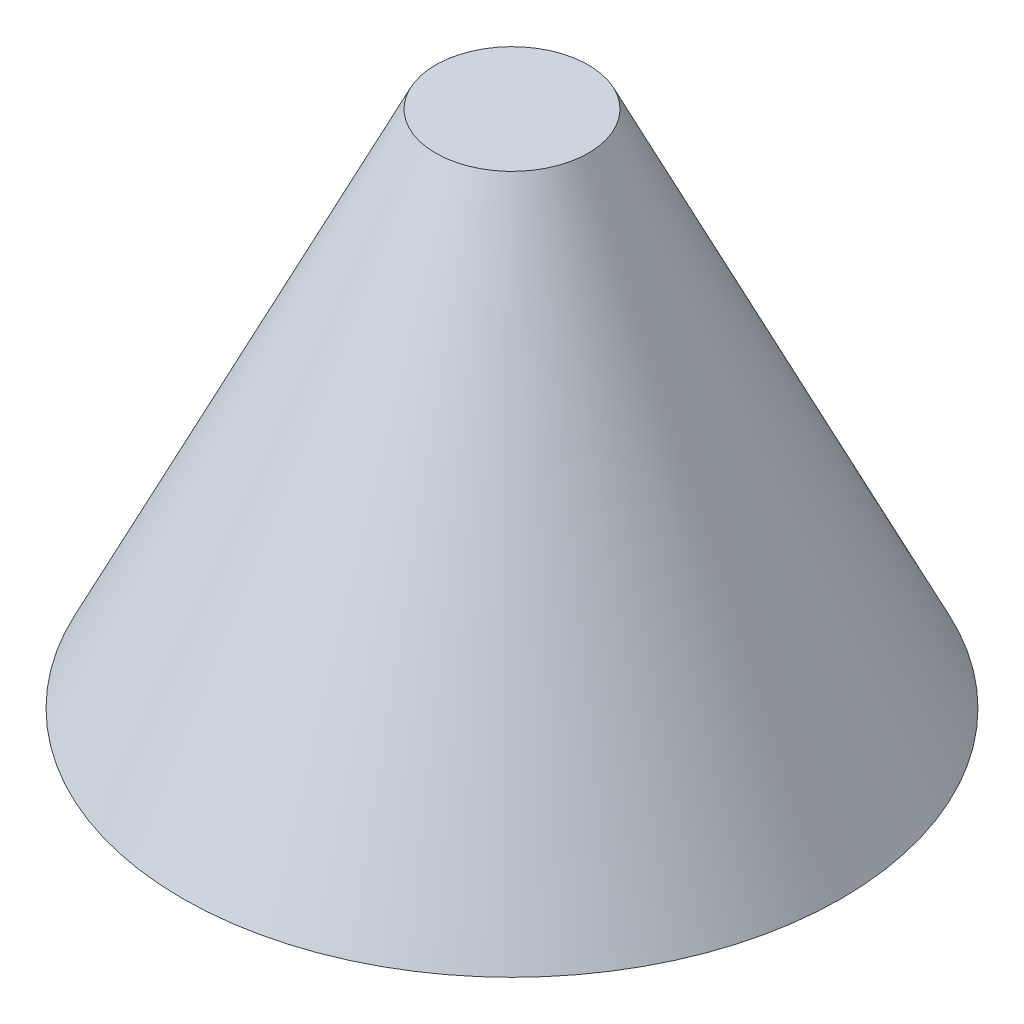
ISO-10303-21;
HEADER;
FILE_DESCRIPTION(('STEP AP214'),'2;1');
FILE_NAME('part.step','',(''),(''),'','','');
FILE_SCHEMA(('AUTOMOTIVE_DESIGN { 1 0 10303 214 1 1 1 1 }'));
ENDSEC;
DATA;
#1=APPLICATION_CONTEXT('core data for automotive mechanical design processes');
#2=APPLICATION_PROTOCOL_DEFINITION('international standard','automotive_design',2000,#1);
#3=PRODUCT_CONTEXT('',#1,'mechanical');
#4=PRODUCT('Part','Part','',(#3));
#5=PRODUCT_RELATED_PRODUCT_CATEGORY('part','',(#4));
#6=PRODUCT_DEFINITION_FORMATION('','',#4);
#7=PRODUCT_DEFINITION_CONTEXT('part definition',#1,'design');
#8=PRODUCT_DEFINITION('design','',#6,#7);
#9=PRODUCT_DEFINITION_SHAPE('','',#8);
#10=(LENGTH_UNIT() NAMED_UNIT(*) SI_UNIT(.MILLI.,.METRE.));
#11=(NAMED_UNIT(*) PLANE_ANGLE_UNIT() SI_UNIT($,.RADIAN.));
#12=(NAMED_UNIT(*) SI_UNIT($,.STERADIAN.) SOLID_ANGLE_UNIT());
#13=UNCERTAINTY_MEASURE_WITH_UNIT(LENGTH_MEASURE(1.E-05),#10,'distance_accuracy_value','');
#14=(GEOMETRIC_REPRESENTATION_CONTEXT(3) GLOBAL_UNCERTAINTY_ASSIGNED_CONTEXT((#13)) GLOBAL_UNIT_ASSIGNED_CONTEXT((#10,
#11,#12)) REPRESENTATION_CONTEXT('',''));
#15=CARTESIAN_POINT('',(0.,0.,0.));
#16=DIRECTION('',(0.,0.,1.));
#17=DIRECTION('',(1.,0.,0.));
#18=AXIS2_PLACEMENT_3D('',#15,#16,#17);
#19=CARTESIAN_POINT('',(0.,0.,0.));
#20=DIRECTION('',(0.,-1.,0.));
#21=DIRECTION('',(0.,0.,1.));
#22=AXIS2_PLACEMENT_3D('',#19,#20,#21);
#23=CONICAL_SURFACE('',#22,50.8,0.453785605518526);
#24=CARTESIAN_POINT('',(0.,80.0099999999999,0.));
#25=DIRECTION('',(0.,1.,0.));
#26=DIRECTION('',(0.,0.,1.));
#27=AXIS2_PLACEMENT_3D('',#24,#25,#26);
#28=CIRCLE('',#27,11.7765155888454);
#29=CARTESIAN_POINT('',(0.,80.0099999999999,11.7765155888454));
#30=VERTEX_POINT('',#29);
#31=EDGE_CURVE('E10',#30,#30,#28,.T.);
#32=CARTESIAN_POINT('',(0.,0.,0.));
#33=DIRECTION('',(0.,1.,0.));
#34=DIRECTION('',(0.,0.,1.));
#35=AXIS2_PLACEMENT_3D('',#32,#33,#34);
#36=CIRCLE('',#35,50.8);
#37=CARTESIAN_POINT('',(0.,0.,50.8));
#38=VERTEX_POINT('',#37);
#39=EDGE_CURVE('E38',#38,#38,#36,.T.);
#40=CARTESIAN_POINT('',(0.,80.0099999999999,11.7765155888454));
#41=CARTESIAN_POINT('',(0.,79.1765624999999,12.1830102181283));
#42=CARTESIAN_POINT('',(0.,78.3431249999999,12.5895048474111));
#43=CARTESIAN_POINT('',(0.,76.6762499999999,13.4024941059769));
#44=CARTESIAN_POINT('',(0.,75.8428124999999,13.8089887352597));
#45=CARTESIAN_POINT('',(0.,74.1759374999999,14.6219779938254));
#46=CARTESIAN_POINT('',(0.,73.3424999999999,15.0284726231083));
#47=CARTESIAN_POINT('',(0.,71.675625,15.841461881674));
#48=CARTESIAN_POINT('',(0.,70.8421875,16.2479565109569));
#49=CARTESIAN_POINT('',(0.,69.1753124999999,17.0609457695226));
#50=CARTESIAN_POINT('',(0.,68.341875,17.4674403988055));
#51=CARTESIAN_POINT('',(0.,66.675,18.2804296573712));
#52=CARTESIAN_POINT('',(0.,65.8415625,18.686924286654));
#53=CARTESIAN_POINT('',(0.,64.1746874999999,19.4999135452198));
#54=CARTESIAN_POINT('',(0.,63.34125,19.9064081745026));
#55=CARTESIAN_POINT('',(0.,61.674375,20.7193974330683));
#56=CARTESIAN_POINT('',(0.,60.8409375,21.1258920623512));
#57=CARTESIAN_POINT('',(0.,59.1740625,21.9388813209169));
#58=CARTESIAN_POINT('',(0.,58.340625,22.3453759501998));
#59=CARTESIAN_POINT('',(0.,56.67375,23.1583652087655));
#60=CARTESIAN_POINT('',(0.,55.8403125,23.5648598380484));
#61=CARTESIAN_POINT('',(0.,54.1734375,24.3778490966141));
#62=CARTESIAN_POINT('',(0.,53.34,24.7843437258969));
#63=CARTESIAN_POINT('',(0.,51.673125,25.5973329844627));
#64=CARTESIAN_POINT('',(0.,50.8396875,26.0038276137455));
#65=CARTESIAN_POINT('',(0.,49.1728125,26.8168168723112));
#66=CARTESIAN_POINT('',(0.,48.339375,27.2233115015941));
#67=CARTESIAN_POINT('',(0.,46.6725,28.0363007601598));
#68=CARTESIAN_POINT('',(0.,45.8390625,28.4427953894427));
#69=CARTESIAN_POINT('',(0.,44.1721875,29.2557846480084));
#70=CARTESIAN_POINT('',(0.,43.33875,29.6622792772913));
#71=CARTESIAN_POINT('',(0.,41.671875,30.475268535857));
#72=CARTESIAN_POINT('',(0.,40.8384375,30.8817631651398));
#73=CARTESIAN_POINT('',(0.,39.1715625,31.6947524237056));
#74=CARTESIAN_POINT('',(0.,38.338125,32.1012470529884));
#75=CARTESIAN_POINT('',(0.,36.67125,32.9142363115541));
#76=CARTESIAN_POINT('',(0.,35.8378125,33.320730940837));
#77=CARTESIAN_POINT('',(0.,34.1709375,34.1337201994027));
#78=CARTESIAN_POINT('',(0.,33.3375,34.5402148286856));
#79=CARTESIAN_POINT('',(0.,31.670625,35.3532040872513));
#80=CARTESIAN_POINT('',(0.,30.8371875,35.7596987165342));
#81=CARTESIAN_POINT('',(0.,29.1703125,36.5726879750999));
#82=CARTESIAN_POINT('',(0.,28.336875,36.9791826043827));
#83=CARTESIAN_POINT('',(0.,26.67,37.7921718629485));
#84=CARTESIAN_POINT('',(0.,25.8365625,38.1986664922313));
#85=CARTESIAN_POINT('',(0.,24.1696875,39.0116557507971));
#86=CARTESIAN_POINT('',(0.,23.33625,39.4181503800799));
#87=CARTESIAN_POINT('',(0.,21.669375,40.2311396386456));
#88=CARTESIAN_POINT('',(0.,20.8359375,40.6376342679285));
#89=CARTESIAN_POINT('',(0.,19.1690625,41.4506235264942));
#90=CARTESIAN_POINT('',(0.,18.335625,41.8571181557771));
#91=CARTESIAN_POINT('',(0.,16.66875,42.6701074143428));
#92=CARTESIAN_POINT('',(0.,15.8353125,43.0766020436257));
#93=CARTESIAN_POINT('',(0.,14.1684375,43.8895913021914));
#94=CARTESIAN_POINT('',(0.,13.335,44.2960859314742));
#95=CARTESIAN_POINT('',(0.,11.668125,45.10907519004));
#96=CARTESIAN_POINT('',(0.,10.8346875,45.5155698193228));
#97=CARTESIAN_POINT('',(0.,9.16781249999999,46.3285590778885));
#98=CARTESIAN_POINT('',(0.,8.33437499999999,46.7350537071714));
#99=CARTESIAN_POINT('',(0.,6.6675,47.5480429657371));
#100=CARTESIAN_POINT('',(0.,5.8340625,47.95453759502));
#101=CARTESIAN_POINT('',(0.,4.1671875,48.7675268535857));
#102=CARTESIAN_POINT('',(0.,3.33375,49.1740214828686));
#103=CARTESIAN_POINT('',(0.,1.666875,49.9870107414343));
#104=CARTESIAN_POINT('',(0.,0.8334375,50.3935053707171));
#105=CARTESIAN_POINT('',(0.,0.,50.8));
#106=B_SPLINE_CURVE_WITH_KNOTS('',3,(#40,#41,#42,#43,#44,#45,#46,#47,#48,#49,#50,#51,#52,#53,
#54,#55,#56,#57,#58,#59,#60,#61,#62,#63,#64,#65,#66,#67,#68,#69,#70,#71,#72,#73,#74,#75,#76,#77,
#78,#79,#80,#81,#82,#83,#84,#85,#86,#87,#88,#89,#90,#91,#92,#93,#94,#95,#96,#97,#98,#99,#100,
#101,#102,#103,#104,#105),.UNSPECIFIED.,.F.,.F.,(4,2,2,2,2,2,2,2,2,2,2,2,2,2,2,2,2,2,2,2,2,2,2,
2,2,2,2,2,2,2,2,2,4),(0.,2.78185253929438,5.56370507858874,8.34555761788311,11.1274101571775,
13.9092626964718,16.6911152357662,19.4729677750606,22.254820314355,25.0366728536493,
27.8185253929437,30.6003779322381,33.3822304715324,36.1640830108268,38.9459355501212,
41.7277880894155,44.5096406287099,47.2914931680043,50.0733457072986,52.855198246593,
55.6370507858874,58.4189033251817,61.2007558644761,63.9826084037705,66.7644609430649,
69.5463134823592,72.3281660216536,75.110018560948,77.8918711002423,80.6737236395367,
83.4555761788311,86.2374287181254,89.0192812574198),.UNSPECIFIED.);
#107=EDGE_CURVE('BSEAM32',#30,#38,#106,.T.);
#108=ORIENTED_EDGE('',*,*,#31,.F.);
#109=ORIENTED_EDGE('',*,*,#39,.T.);
#110=ORIENTED_EDGE('',*,*,#107,.T.);
#111=ORIENTED_EDGE('',*,*,#107,.F.);
#112=EDGE_LOOP('',(#108,#110,#109,#111));
#113=FACE_BOUND('',#112,.T.);
#114=ADVANCED_FACE('F32',(#113),#23,.T.);
#115=CARTESIAN_POINT('',(0.,80.0099999999999,0.));
#116=DIRECTION('',(0.,1.,0.));
#117=DIRECTION('',(0.,0.,1.));
#118=AXIS2_PLACEMENT_3D('',#115,#116,#117);
#119=PLANE('',#118);
#120=ORIENTED_EDGE('',*,*,#31,.T.);
#121=EDGE_LOOP('',(#120));
#122=FACE_BOUND('',#121,.T.);
#123=ADVANCED_FACE('F47',(#122),#119,.T.);
#124=CARTESIAN_POINT('',(0.,0.,0.));
#125=DIRECTION('',(0.,1.,0.));
#126=DIRECTION('',(0.,0.,1.));
#127=AXIS2_PLACEMENT_3D('',#124,#125,#126);
#128=PLANE('',#127);
#129=ORIENTED_EDGE('',*,*,#39,.F.);
#130=EDGE_LOOP('',(#129));
#131=FACE_BOUND('',#130,.T.);
#132=ADVANCED_FACE('F45',(#131),#128,.F.);
#133=CLOSED_SHELL('',(#114,#123,#132));
#134=MANIFOLD_SOLID_BREP('B2',#133);
#135=ADVANCED_BREP_SHAPE_REPRESENTATION('',(#18,#134),#14);
#136=SHAPE_DEFINITION_REPRESENTATION(#9,#135);
ENDSEC;
END-ISO-10303-21;
